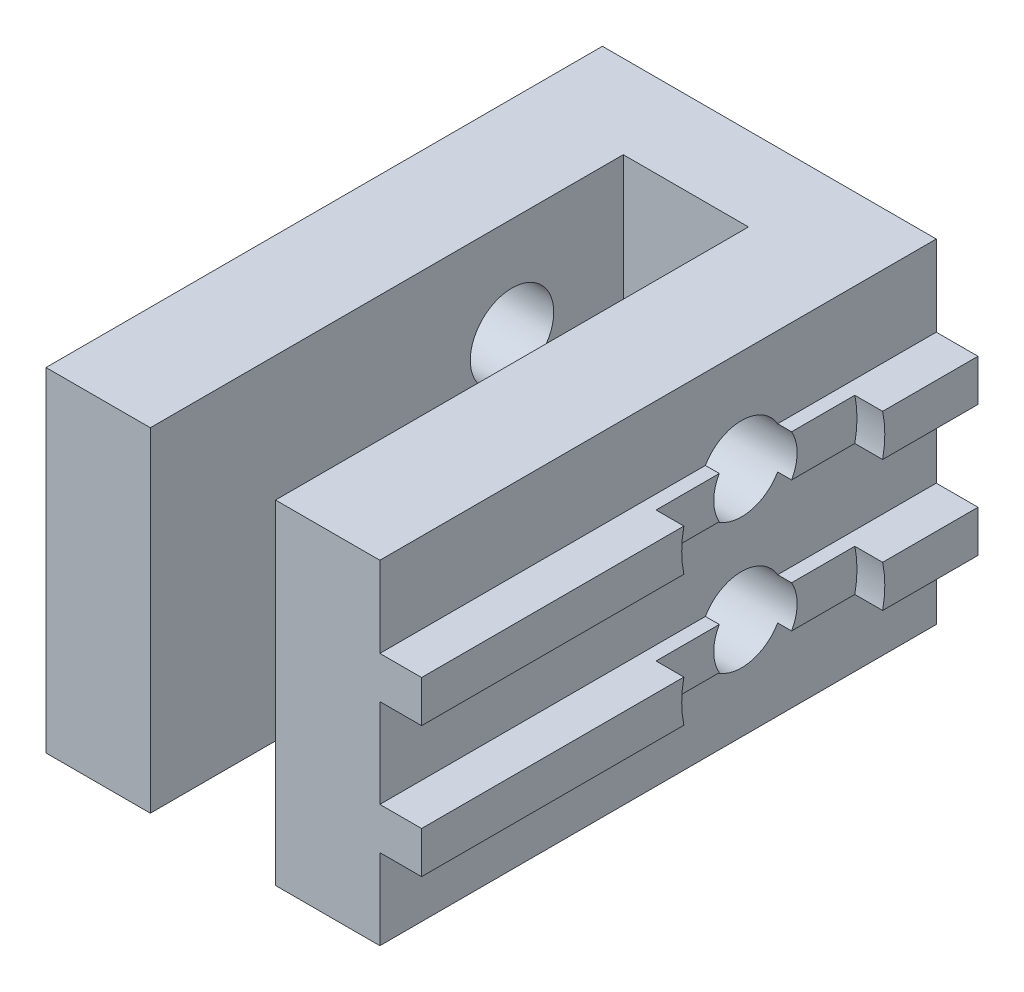
ISO-10303-21;
HEADER;
FILE_DESCRIPTION(('STEP AP214'),'2;1');
FILE_NAME('part.step','',(''),(''),'','','');
FILE_SCHEMA(('AUTOMOTIVE_DESIGN { 1 0 10303 214 1 1 1 1 }'));
ENDSEC;
DATA;
#1=APPLICATION_CONTEXT('core data for automotive mechanical design processes');
#2=APPLICATION_PROTOCOL_DEFINITION('international standard','automotive_design',2000,#1);
#3=PRODUCT_CONTEXT('',#1,'mechanical');
#4=PRODUCT('Part','Part','',(#3));
#5=PRODUCT_RELATED_PRODUCT_CATEGORY('part','',(#4));
#6=PRODUCT_DEFINITION_FORMATION('','',#4);
#7=PRODUCT_DEFINITION_CONTEXT('part definition',#1,'design');
#8=PRODUCT_DEFINITION('design','',#6,#7);
#9=PRODUCT_DEFINITION_SHAPE('','',#8);
#10=(LENGTH_UNIT() NAMED_UNIT(*) SI_UNIT(.MILLI.,.METRE.));
#11=(NAMED_UNIT(*) PLANE_ANGLE_UNIT() SI_UNIT($,.RADIAN.));
#12=(NAMED_UNIT(*) SI_UNIT($,.STERADIAN.) SOLID_ANGLE_UNIT());
#13=UNCERTAINTY_MEASURE_WITH_UNIT(LENGTH_MEASURE(1.E-05),#10,'distance_accuracy_value','');
#14=(GEOMETRIC_REPRESENTATION_CONTEXT(3) GLOBAL_UNCERTAINTY_ASSIGNED_CONTEXT((#13)) GLOBAL_UNIT_ASSIGNED_CONTEXT((#10,
#11,#12)) REPRESENTATION_CONTEXT('',''));
#15=CARTESIAN_POINT('',(0.,0.,0.));
#16=DIRECTION('',(0.,0.,1.));
#17=DIRECTION('',(1.,0.,0.));
#18=AXIS2_PLACEMENT_3D('',#15,#16,#17);
#19=CARTESIAN_POINT('',(13.5,2.9,20.));
#20=DIRECTION('',(0.,1.,0.));
#21=DIRECTION('',(-1.,0.,0.));
#22=AXIS2_PLACEMENT_3D('',#19,#20,#21);
#23=PLANE('',#22);
#24=DIRECTION('',(0.,0.,-1.));
#25=VECTOR('',#24,1.);
#26=CARTESIAN_POINT('',(12.,2.9,20.));
#27=LINE('',#26,#25);
#28=CARTESIAN_POINT('',(12.,2.9,20.));
#29=VERTEX_POINT('',#28);
#30=CARTESIAN_POINT('',(12.,2.9,8.29903810567666));
#31=VERTEX_POINT('',#30);
#32=EDGE_CURVE('E410',#29,#31,#27,.T.);
#33=ORIENTED_EDGE('',*,*,#32,.T.);
#34=DIRECTION('',(1.,0.,0.));
#35=VECTOR('',#34,1.);
#36=CARTESIAN_POINT('',(0.,2.89999999999999,8.29903810567665));
#37=LINE('',#36,#35);
#38=CARTESIAN_POINT('',(12.5,2.89999999999999,8.29903810567665));
#39=VERTEX_POINT('',#38);
#40=EDGE_CURVE('E492',#31,#39,#37,.T.);
#41=ORIENTED_EDGE('',*,*,#40,.T.);
#42=DIRECTION('',(0.,0.,-1.));
#43=VECTOR('',#42,1.);
#44=CARTESIAN_POINT('',(12.5,2.9,20.));
#45=LINE('',#44,#43);
#46=CARTESIAN_POINT('',(12.5,2.9,10.5721142198983));
#47=VERTEX_POINT('',#46);
#48=EDGE_CURVE('E270',#47,#39,#45,.T.);
#49=ORIENTED_EDGE('',*,*,#48,.F.);
#50=DIRECTION('',(1.,0.,0.));
#51=VECTOR('',#50,1.);
#52=CARTESIAN_POINT('',(12.5,2.9,10.5721142198983));
#53=LINE('',#52,#51);
#54=CARTESIAN_POINT('',(13.5,2.9,10.5721142198983));
#55=VERTEX_POINT('',#54);
#56=EDGE_CURVE('E286',#47,#55,#53,.T.);
#57=ORIENTED_EDGE('',*,*,#56,.T.);
#58=DIRECTION('',(0.,0.,-1.));
#59=VECTOR('',#58,1.);
#60=CARTESIAN_POINT('',(13.5,2.9,20.));
#61=LINE('',#60,#59);
#62=CARTESIAN_POINT('',(13.5,2.9,20.));
#63=VERTEX_POINT('',#62);
#64=EDGE_CURVE('E406',#63,#55,#61,.T.);
#65=ORIENTED_EDGE('',*,*,#64,.F.);
#66=DIRECTION('',(1.,0.,0.));
#67=VECTOR('',#66,1.);
#68=CARTESIAN_POINT('',(13.5,2.9,20.));
#69=LINE('',#68,#67);
#70=EDGE_CURVE('E326',#29,#63,#69,.T.);
#71=ORIENTED_EDGE('',*,*,#70,.F.);
#72=EDGE_LOOP('',(#33,#41,#49,#57,#65,#71));
#73=FACE_BOUND('',#72,.T.);
#74=ADVANCED_FACE('F35',(#73),#23,.F.);
#75=CARTESIAN_POINT('',(12.,4.4,20.));
#76=DIRECTION('',(0.,-1.,0.));
#77=DIRECTION('',(0.,0.,-1.));
#78=AXIS2_PLACEMENT_3D('',#75,#76,#77);
#79=PLANE('',#78);
#80=DIRECTION('',(0.,0.,-1.));
#81=VECTOR('',#80,1.);
#82=CARTESIAN_POINT('',(12.,4.4,20.));
#83=LINE('',#82,#81);
#84=CARTESIAN_POINT('',(12.,4.4,5.70096189432334));
#85=VERTEX_POINT('',#84);
#86=CARTESIAN_POINT('',(12.,4.4,0.));
#87=VERTEX_POINT('',#86);
#88=EDGE_CURVE('E262',#85,#87,#83,.T.);
#89=ORIENTED_EDGE('',*,*,#88,.F.);
#90=DIRECTION('',(1.,0.,0.));
#91=VECTOR('',#90,1.);
#92=CARTESIAN_POINT('',(0.,4.4,5.70096189432334));
#93=LINE('',#92,#91);
#94=CARTESIAN_POINT('',(12.5,4.4,5.70096189432334));
#95=VERTEX_POINT('',#94);
#96=EDGE_CURVE('E249',#85,#95,#93,.T.);
#97=ORIENTED_EDGE('',*,*,#96,.T.);
#98=DIRECTION('',(0.,0.,1.));
#99=VECTOR('',#98,1.);
#100=CARTESIAN_POINT('',(12.5,4.4,20.));
#101=LINE('',#100,#99);
#102=CARTESIAN_POINT('',(12.5,4.4,3.42788578010165));
#103=VERTEX_POINT('',#102);
#104=EDGE_CURVE('E260',#103,#95,#101,.T.);
#105=ORIENTED_EDGE('',*,*,#104,.F.);
#106=DIRECTION('',(1.,0.,0.));
#107=VECTOR('',#106,1.);
#108=CARTESIAN_POINT('',(12.5,4.4,3.42788578010165));
#109=LINE('',#108,#107);
#110=CARTESIAN_POINT('',(13.5,4.4,3.42788578010165));
#111=VERTEX_POINT('',#110);
#112=EDGE_CURVE('E11',#103,#111,#109,.T.);
#113=ORIENTED_EDGE('',*,*,#112,.T.);
#114=DIRECTION('',(0.,0.,-1.));
#115=VECTOR('',#114,1.);
#116=CARTESIAN_POINT('',(13.5,4.4,20.));
#117=LINE('',#116,#115);
#118=CARTESIAN_POINT('',(13.5,4.4,0.));
#119=VERTEX_POINT('',#118);
#120=EDGE_CURVE('E401',#111,#119,#117,.T.);
#121=ORIENTED_EDGE('',*,*,#120,.T.);
#122=DIRECTION('',(-1.,0.,0.));
#123=VECTOR('',#122,1.);
#124=CARTESIAN_POINT('',(12.,4.4,0.));
#125=LINE('',#124,#123);
#126=EDGE_CURVE('E360',#119,#87,#125,.T.);
#127=ORIENTED_EDGE('',*,*,#126,.T.);
#128=EDGE_LOOP('',(#89,#97,#105,#113,#121,#127));
#129=FACE_BOUND('',#128,.T.);
#130=ADVANCED_FACE('F259',(#129),#79,.F.);
#131=CARTESIAN_POINT('',(13.5,7.6,20.));
#132=DIRECTION('',(0.,1.,0.));
#133=DIRECTION('',(-1.,0.,0.));
#134=AXIS2_PLACEMENT_3D('',#131,#132,#133);
#135=PLANE('',#134);
#136=DIRECTION('',(0.,0.,-1.));
#137=VECTOR('',#136,1.);
#138=CARTESIAN_POINT('',(12.,7.6,20.));
#139=LINE('',#138,#137);
#140=CARTESIAN_POINT('',(12.,7.6,20.));
#141=VERTEX_POINT('',#140);
#142=CARTESIAN_POINT('',(12.,7.6,8.29903810567666));
#143=VERTEX_POINT('',#142);
#144=EDGE_CURVE('E395',#141,#143,#139,.T.);
#145=ORIENTED_EDGE('',*,*,#144,.T.);
#146=DIRECTION('',(1.,0.,0.));
#147=VECTOR('',#146,1.);
#148=CARTESIAN_POINT('',(0.,7.59999999999999,8.29903810567665));
#149=LINE('',#148,#147);
#150=CARTESIAN_POINT('',(12.5,7.59999999999999,8.29903810567665));
#151=VERTEX_POINT('',#150);
#152=EDGE_CURVE('E470',#143,#151,#149,.T.);
#153=ORIENTED_EDGE('',*,*,#152,.T.);
#154=DIRECTION('',(0.,0.,-1.));
#155=VECTOR('',#154,1.);
#156=CARTESIAN_POINT('',(12.5,7.6,20.));
#157=LINE('',#156,#155);
#158=CARTESIAN_POINT('',(12.5,7.6,10.5721142198983));
#159=VERTEX_POINT('',#158);
#160=EDGE_CURVE('E272',#159,#151,#157,.T.);
#161=ORIENTED_EDGE('',*,*,#160,.F.);
#162=DIRECTION('',(1.,0.,0.));
#163=VECTOR('',#162,1.);
#164=CARTESIAN_POINT('',(12.5,7.6,10.5721142198983));
#165=LINE('',#164,#163);
#166=CARTESIAN_POINT('',(13.5,7.6,10.5721142198983));
#167=VERTEX_POINT('',#166);
#168=EDGE_CURVE('E280',#159,#167,#165,.T.);
#169=ORIENTED_EDGE('',*,*,#168,.T.);
#170=DIRECTION('',(0.,0.,-1.));
#171=VECTOR('',#170,1.);
#172=CARTESIAN_POINT('',(13.5,7.6,20.));
#173=LINE('',#172,#171);
#174=CARTESIAN_POINT('',(13.5,7.6,20.));
#175=VERTEX_POINT('',#174);
#176=EDGE_CURVE('E391',#175,#167,#173,.T.);
#177=ORIENTED_EDGE('',*,*,#176,.F.);
#178=DIRECTION('',(1.,0.,0.));
#179=VECTOR('',#178,1.);
#180=CARTESIAN_POINT('',(13.5,7.6,20.));
#181=LINE('',#180,#179);
#182=EDGE_CURVE('E334',#141,#175,#181,.T.);
#183=ORIENTED_EDGE('',*,*,#182,.F.);
#184=EDGE_LOOP('',(#145,#153,#161,#169,#177,#183));
#185=FACE_BOUND('',#184,.T.);
#186=ADVANCED_FACE('F612',(#185),#135,.F.);
#187=CARTESIAN_POINT('',(12.,9.1,20.));
#188=DIRECTION('',(0.,-1.,0.));
#189=DIRECTION('',(0.,0.,-1.));
#190=AXIS2_PLACEMENT_3D('',#187,#188,#189);
#191=PLANE('',#190);
#192=DIRECTION('',(0.,0.,-1.));
#193=VECTOR('',#192,1.);
#194=CARTESIAN_POINT('',(12.,9.1,20.));
#195=LINE('',#194,#193);
#196=CARTESIAN_POINT('',(12.,9.1,5.70096189432334));
#197=VERTEX_POINT('',#196);
#198=CARTESIAN_POINT('',(12.,9.1,0.));
#199=VERTEX_POINT('',#198);
#200=EDGE_CURVE('E382',#197,#199,#195,.T.);
#201=ORIENTED_EDGE('',*,*,#200,.F.);
#202=DIRECTION('',(1.,0.,0.));
#203=VECTOR('',#202,1.);
#204=CARTESIAN_POINT('',(0.,9.1,5.70096189432334));
#205=LINE('',#204,#203);
#206=CARTESIAN_POINT('',(12.5,9.1,5.70096189432334));
#207=VERTEX_POINT('',#206);
#208=EDGE_CURVE('E463',#197,#207,#205,.T.);
#209=ORIENTED_EDGE('',*,*,#208,.T.);
#210=DIRECTION('',(0.,0.,1.));
#211=VECTOR('',#210,1.);
#212=CARTESIAN_POINT('',(12.5,9.1,20.));
#213=LINE('',#212,#211);
#214=CARTESIAN_POINT('',(12.5,9.1,3.42788578010165));
#215=VERTEX_POINT('',#214);
#216=EDGE_CURVE('E422',#215,#207,#213,.T.);
#217=ORIENTED_EDGE('',*,*,#216,.F.);
#218=DIRECTION('',(1.,0.,0.));
#219=VECTOR('',#218,1.);
#220=CARTESIAN_POINT('',(12.5,9.1,3.42788578010165));
#221=LINE('',#220,#219);
#222=CARTESIAN_POINT('',(13.5,9.1,3.42788578010165));
#223=VERTEX_POINT('',#222);
#224=EDGE_CURVE('E425',#215,#223,#221,.T.);
#225=ORIENTED_EDGE('',*,*,#224,.T.);
#226=DIRECTION('',(0.,0.,-1.));
#227=VECTOR('',#226,1.);
#228=CARTESIAN_POINT('',(13.5,9.1,20.));
#229=LINE('',#228,#227);
#230=CARTESIAN_POINT('',(13.5,9.1,0.));
#231=VERTEX_POINT('',#230);
#232=EDGE_CURVE('E386',#223,#231,#229,.T.);
#233=ORIENTED_EDGE('',*,*,#232,.T.);
#234=DIRECTION('',(-1.,0.,0.));
#235=VECTOR('',#234,1.);
#236=CARTESIAN_POINT('',(12.,9.1,0.));
#237=LINE('',#236,#235);
#238=EDGE_CURVE('E371',#231,#199,#237,.T.);
#239=ORIENTED_EDGE('',*,*,#238,.T.);
#240=EDGE_LOOP('',(#201,#209,#217,#225,#233,#239));
#241=FACE_BOUND('',#240,.T.);
#242=ADVANCED_FACE('F652',(#241),#191,.F.);
#243=CARTESIAN_POINT('',(13.5,4.4,20.));
#244=DIRECTION('',(-1.,0.,0.));
#245=DIRECTION('',(0.,0.,1.));
#246=AXIS2_PLACEMENT_3D('',#243,#244,#245);
#247=PLANE('',#246);
#248=ORIENTED_EDGE('',*,*,#120,.F.);
#249=CARTESIAN_POINT('',(13.5,3.65,7.));
#250=DIRECTION('',(1.,0.,0.));
#251=DIRECTION('',(0.,0.,-1.));
#252=AXIS2_PLACEMENT_3D('',#249,#250,#251);
#253=CIRCLE('',#252,3.65);
#254=CARTESIAN_POINT('',(13.5,2.9,3.42788578010165));
#255=VERTEX_POINT('',#254);
#256=EDGE_CURVE('E446',#255,#111,#253,.T.);
#257=ORIENTED_EDGE('',*,*,#256,.F.);
#258=CARTESIAN_POINT('',(13.5,2.9,0.));
#259=VERTEX_POINT('',#258);
#260=EDGE_CURVE('E405',#255,#259,#61,.T.);
#261=ORIENTED_EDGE('',*,*,#260,.T.);
#262=DIRECTION('',(0.,1.,0.));
#263=VECTOR('',#262,1.);
#264=CARTESIAN_POINT('',(13.5,4.4,0.));
#265=LINE('',#264,#263);
#266=EDGE_CURVE('E357',#259,#119,#265,.T.);
#267=ORIENTED_EDGE('',*,*,#266,.T.);
#268=EDGE_LOOP('',(#248,#257,#261,#267));
#269=FACE_BOUND('',#268,.T.);
#270=ADVANCED_FACE('F621',(#269),#247,.F.);
#271=CARTESIAN_POINT('',(13.5,9.1,20.));
#272=DIRECTION('',(-1.,0.,0.));
#273=DIRECTION('',(0.,0.,1.));
#274=AXIS2_PLACEMENT_3D('',#271,#272,#273);
#275=PLANE('',#274);
#276=ORIENTED_EDGE('',*,*,#232,.F.);
#277=CARTESIAN_POINT('',(13.5,8.35,7.));
#278=DIRECTION('',(1.,0.,0.));
#279=DIRECTION('',(0.,0.,-1.));
#280=AXIS2_PLACEMENT_3D('',#277,#278,#279);
#281=CIRCLE('',#280,3.65);
#282=CARTESIAN_POINT('',(13.5,7.6,3.42788578010165));
#283=VERTEX_POINT('',#282);
#284=EDGE_CURVE('E448',#283,#223,#281,.T.);
#285=ORIENTED_EDGE('',*,*,#284,.F.);
#286=CARTESIAN_POINT('',(13.5,7.6,0.));
#287=VERTEX_POINT('',#286);
#288=EDGE_CURVE('E390',#283,#287,#173,.T.);
#289=ORIENTED_EDGE('',*,*,#288,.T.);
#290=DIRECTION('',(0.,1.,0.));
#291=VECTOR('',#290,1.);
#292=CARTESIAN_POINT('',(13.5,9.1,0.));
#293=LINE('',#292,#291);
#294=EDGE_CURVE('E368',#287,#231,#293,.T.);
#295=ORIENTED_EDGE('',*,*,#294,.T.);
#296=EDGE_LOOP('',(#276,#285,#289,#295));
#297=FACE_BOUND('',#296,.T.);
#298=ADVANCED_FACE('F631',(#297),#275,.F.);
#299=CARTESIAN_POINT('',(0.,12.,20.));
#300=DIRECTION('',(0.,0.,-1.));
#301=DIRECTION('',(-1.,0.,0.));
#302=AXIS2_PLACEMENT_3D('',#299,#300,#301);
#303=PLANE('',#302);
#304=DIRECTION('',(1.,0.,0.));
#305=VECTOR('',#304,1.);
#306=CARTESIAN_POINT('',(0.,0.,20.));
#307=LINE('',#306,#305);
#308=CARTESIAN_POINT('',(0.,0.,20.));
#309=VERTEX_POINT('',#308);
#310=CARTESIAN_POINT('',(3.75,0.,20.));
#311=VERTEX_POINT('',#310);
#312=EDGE_CURVE('E321',#309,#311,#307,.T.);
#313=ORIENTED_EDGE('',*,*,#312,.T.);
#314=DIRECTION('',(0.,-1.,0.));
#315=VECTOR('',#314,1.);
#316=CARTESIAN_POINT('',(3.75,12.,20.));
#317=LINE('',#316,#315);
#318=CARTESIAN_POINT('',(3.75,12.,20.));
#319=VERTEX_POINT('',#318);
#320=EDGE_CURVE('E289',#319,#311,#317,.T.);
#321=ORIENTED_EDGE('',*,*,#320,.F.);
#322=DIRECTION('',(-1.,0.,0.));
#323=VECTOR('',#322,1.);
#324=CARTESIAN_POINT('',(0.,12.,20.));
#325=LINE('',#324,#323);
#326=CARTESIAN_POINT('',(0.,12.,20.));
#327=VERTEX_POINT('',#326);
#328=EDGE_CURVE('E342',#319,#327,#325,.T.);
#329=ORIENTED_EDGE('',*,*,#328,.T.);
#330=DIRECTION('',(0.,-1.,0.));
#331=VECTOR('',#330,1.);
#332=CARTESIAN_POINT('',(0.,0.,20.));
#333=LINE('',#332,#331);
#334=EDGE_CURVE('E316',#327,#309,#333,.T.);
#335=ORIENTED_EDGE('',*,*,#334,.T.);
#336=EDGE_LOOP('',(#313,#321,#329,#335));
#337=FACE_BOUND('',#336,.T.);
#338=ADVANCED_FACE('F527',(#337),#303,.F.);
#339=CARTESIAN_POINT('',(0.,0.,20.));
#340=DIRECTION('',(1.,0.,0.));
#341=DIRECTION('',(0.,0.,-1.));
#342=AXIS2_PLACEMENT_3D('',#339,#340,#341);
#343=PLANE('',#342);
#344=CARTESIAN_POINT('',(0.,3.65,7.));
#345=DIRECTION('',(1.,0.,0.));
#346=DIRECTION('',(0.,0.,-1.));
#347=AXIS2_PLACEMENT_3D('',#344,#345,#346);
#348=CIRCLE('',#347,1.5);
#349=CARTESIAN_POINT('',(0.,3.65,5.5));
#350=VERTEX_POINT('',#349);
#351=EDGE_CURVE('E498',#350,#350,#348,.T.);
#352=ORIENTED_EDGE('',*,*,#351,.T.);
#353=EDGE_LOOP('',(#352));
#354=FACE_BOUND('',#353,.T.);
#355=CARTESIAN_POINT('',(0.,8.35,7.));
#356=DIRECTION('',(1.,0.,0.));
#357=DIRECTION('',(0.,0.,-1.));
#358=AXIS2_PLACEMENT_3D('',#355,#356,#357);
#359=CIRCLE('',#358,1.5);
#360=CARTESIAN_POINT('',(0.,8.35,5.5));
#361=VERTEX_POINT('',#360);
#362=EDGE_CURVE('E479',#361,#361,#359,.T.);
#363=ORIENTED_EDGE('',*,*,#362,.T.);
#364=EDGE_LOOP('',(#363));
#365=FACE_BOUND('',#364,.T.);
#366=DIRECTION('',(0.,-1.,0.));
#367=VECTOR('',#366,1.);
#368=CARTESIAN_POINT('',(0.,0.,0.));
#369=LINE('',#368,#367);
#370=CARTESIAN_POINT('',(0.,12.,0.));
#371=VERTEX_POINT('',#370);
#372=CARTESIAN_POINT('',(0.,0.,0.));
#373=VERTEX_POINT('',#372);
#374=EDGE_CURVE('E308',#371,#373,#369,.T.);
#375=ORIENTED_EDGE('',*,*,#374,.T.);
#376=DIRECTION('',(0.,0.,-1.));
#377=VECTOR('',#376,1.);
#378=CARTESIAN_POINT('',(0.,0.,20.));
#379=LINE('',#378,#377);
#380=EDGE_CURVE('E416',#309,#373,#379,.T.);
#381=ORIENTED_EDGE('',*,*,#380,.F.);
#382=ORIENTED_EDGE('',*,*,#334,.F.);
#383=DIRECTION('',(0.,0.,-1.));
#384=VECTOR('',#383,1.);
#385=CARTESIAN_POINT('',(0.,12.,20.));
#386=LINE('',#385,#384);
#387=EDGE_CURVE('E346',#327,#371,#386,.T.);
#388=ORIENTED_EDGE('',*,*,#387,.T.);
#389=EDGE_LOOP('',(#375,#381,#382,#388));
#390=FACE_BOUND('',#389,.T.);
#391=ADVANCED_FACE('F37',(#354,#365,#390),#343,.F.);
#392=CARTESIAN_POINT('',(0.,0.,20.));
#393=DIRECTION('',(0.,1.,0.));
#394=DIRECTION('',(0.,0.,1.));
#395=AXIS2_PLACEMENT_3D('',#392,#393,#394);
#396=PLANE('',#395);
#397=DIRECTION('',(1.,0.,0.));
#398=VECTOR('',#397,1.);
#399=CARTESIAN_POINT('',(3.75,0.,3.));
#400=LINE('',#399,#398);
#401=CARTESIAN_POINT('',(3.75,0.,3.));
#402=VERTEX_POINT('',#401);
#403=CARTESIAN_POINT('',(8.25,0.,3.));
#404=VERTEX_POINT('',#403);
#405=EDGE_CURVE('E293',#402,#404,#400,.T.);
#406=ORIENTED_EDGE('',*,*,#405,.F.);
#407=DIRECTION('',(0.,0.,1.));
#408=VECTOR('',#407,1.);
#409=CARTESIAN_POINT('',(3.75,0.,3.));
#410=LINE('',#409,#408);
#411=EDGE_CURVE('E303',#402,#311,#410,.T.);
#412=ORIENTED_EDGE('',*,*,#411,.T.);
#413=ORIENTED_EDGE('',*,*,#312,.F.);
#414=ORIENTED_EDGE('',*,*,#380,.T.);
#415=DIRECTION('',(1.,0.,0.));
#416=VECTOR('',#415,1.);
#417=CARTESIAN_POINT('',(0.,0.,0.));
#418=LINE('',#417,#416);
#419=CARTESIAN_POINT('',(12.,0.,0.));
#420=VERTEX_POINT('',#419);
#421=EDGE_CURVE('E349',#373,#420,#418,.T.);
#422=ORIENTED_EDGE('',*,*,#421,.T.);
#423=DIRECTION('',(0.,0.,-1.));
#424=VECTOR('',#423,1.);
#425=CARTESIAN_POINT('',(12.,0.,20.));
#426=LINE('',#425,#424);
#427=CARTESIAN_POINT('',(12.,0.,20.));
#428=VERTEX_POINT('',#427);
#429=EDGE_CURVE('E413',#428,#420,#426,.T.);
#430=ORIENTED_EDGE('',*,*,#429,.F.);
#431=CARTESIAN_POINT('',(8.25,0.,20.));
#432=VERTEX_POINT('',#431);
#433=EDGE_CURVE('E319',#432,#428,#307,.T.);
#434=ORIENTED_EDGE('',*,*,#433,.F.);
#435=DIRECTION('',(0.,0.,1.));
#436=VECTOR('',#435,1.);
#437=CARTESIAN_POINT('',(8.25,0.,3.));
#438=LINE('',#437,#436);
#439=EDGE_CURVE('E312',#404,#432,#438,.T.);
#440=ORIENTED_EDGE('',*,*,#439,.F.);
#441=EDGE_LOOP('',(#406,#412,#413,#414,#422,#430,#434,#440));
#442=FACE_BOUND('',#441,.T.);
#443=ADVANCED_FACE('F525',(#442),#396,.F.);
#444=CARTESIAN_POINT('',(12.,0.,20.));
#445=DIRECTION('',(-1.,0.,0.));
#446=DIRECTION('',(0.,0.,1.));
#447=AXIS2_PLACEMENT_3D('',#444,#445,#446);
#448=PLANE('',#447);
#449=CARTESIAN_POINT('',(12.,2.89999999999999,5.70096189432335));
#450=VERTEX_POINT('',#449);
#451=CARTESIAN_POINT('',(12.,2.9,0.));
#452=VERTEX_POINT('',#451);
#453=EDGE_CURVE('E409',#450,#452,#27,.T.);
#454=ORIENTED_EDGE('',*,*,#453,.F.);
#455=CARTESIAN_POINT('',(12.,3.65,7.));
#456=DIRECTION('',(-1.,0.,0.));
#457=DIRECTION('',(0.,0.,1.));
#458=AXIS2_PLACEMENT_3D('',#455,#456,#457);
#459=CIRCLE('',#458,1.5);
#460=EDGE_CURVE('E495',#450,#31,#459,.T.);
#461=ORIENTED_EDGE('',*,*,#460,.T.);
#462=ORIENTED_EDGE('',*,*,#32,.F.);
#463=DIRECTION('',(0.,1.,0.));
#464=VECTOR('',#463,1.);
#465=CARTESIAN_POINT('',(12.,0.,20.));
#466=LINE('',#465,#464);
#467=EDGE_CURVE('E324',#428,#29,#466,.T.);
#468=ORIENTED_EDGE('',*,*,#467,.F.);
#469=ORIENTED_EDGE('',*,*,#429,.T.);
#470=DIRECTION('',(0.,1.,0.));
#471=VECTOR('',#470,1.);
#472=CARTESIAN_POINT('',(12.,0.,0.));
#473=LINE('',#472,#471);
#474=EDGE_CURVE('E351',#420,#452,#473,.T.);
#475=ORIENTED_EDGE('',*,*,#474,.T.);
#476=EDGE_LOOP('',(#454,#461,#462,#468,#469,#475));
#477=FACE_BOUND('',#476,.T.);
#478=ADVANCED_FACE('F540',(#477),#448,.F.);
#479=CARTESIAN_POINT('',(12.5,2.9,5.70096189432334));
#480=VERTEX_POINT('',#479);
#481=CARTESIAN_POINT('',(12.5,2.9,3.42788578010165));
#482=VERTEX_POINT('',#481);
#483=EDGE_CURVE('E267',#480,#482,#45,.T.);
#484=ORIENTED_EDGE('',*,*,#483,.F.);
#485=DIRECTION('',(1.,0.,0.));
#486=VECTOR('',#485,1.);
#487=CARTESIAN_POINT('',(0.,2.89999999999999,5.70096189432335));
#488=LINE('',#487,#486);
#489=EDGE_CURVE('E252',#480,#450,#488,.F.);
#490=ORIENTED_EDGE('',*,*,#489,.T.);
#491=ORIENTED_EDGE('',*,*,#453,.T.);
#492=DIRECTION('',(1.,0.,0.));
#493=VECTOR('',#492,1.);
#494=CARTESIAN_POINT('',(13.5,2.9,0.));
#495=LINE('',#494,#493);
#496=EDGE_CURVE('E354',#452,#259,#495,.T.);
#497=ORIENTED_EDGE('',*,*,#496,.T.);
#498=ORIENTED_EDGE('',*,*,#260,.F.);
#499=DIRECTION('',(1.,0.,0.));
#500=VECTOR('',#499,1.);
#501=CARTESIAN_POINT('',(12.5,2.9,3.42788578010165));
#502=LINE('',#501,#500);
#503=EDGE_CURVE('E283',#255,#482,#502,.F.);
#504=ORIENTED_EDGE('',*,*,#503,.T.);
#505=EDGE_LOOP('',(#484,#490,#491,#497,#498,#504));
#506=FACE_BOUND('',#505,.T.);
#507=ADVANCED_FACE('F547',(#506),#23,.F.);
#508=ORIENTED_EDGE('',*,*,#64,.T.);
#509=CARTESIAN_POINT('',(13.5,4.4,10.5721142198983));
#510=VERTEX_POINT('',#509);
#511=EDGE_CURVE('E438',#510,#55,#253,.T.);
#512=ORIENTED_EDGE('',*,*,#511,.F.);
#513=CARTESIAN_POINT('',(13.5,4.4,20.));
#514=VERTEX_POINT('',#513);
#515=EDGE_CURVE('E402',#514,#510,#117,.T.);
#516=ORIENTED_EDGE('',*,*,#515,.F.);
#517=DIRECTION('',(0.,1.,0.));
#518=VECTOR('',#517,1.);
#519=CARTESIAN_POINT('',(13.5,4.4,20.));
#520=LINE('',#519,#518);
#521=EDGE_CURVE('E328',#63,#514,#520,.T.);
#522=ORIENTED_EDGE('',*,*,#521,.F.);
#523=EDGE_LOOP('',(#508,#512,#516,#522));
#524=FACE_BOUND('',#523,.T.);
#525=ADVANCED_FACE('F442',(#524),#247,.F.);
#526=CARTESIAN_POINT('',(12.5,4.4,8.29903810567666));
#527=VERTEX_POINT('',#526);
#528=CARTESIAN_POINT('',(12.5,4.4,10.5721142198983));
#529=VERTEX_POINT('',#528);
#530=EDGE_CURVE('E268',#527,#529,#101,.T.);
#531=ORIENTED_EDGE('',*,*,#530,.F.);
#532=DIRECTION('',(1.,0.,0.));
#533=VECTOR('',#532,1.);
#534=CARTESIAN_POINT('',(0.,4.4,8.29903810567666));
#535=LINE('',#534,#533);
#536=CARTESIAN_POINT('',(12.,4.4,8.29903810567666));
#537=VERTEX_POINT('',#536);
#538=EDGE_CURVE('E490',#527,#537,#535,.F.);
#539=ORIENTED_EDGE('',*,*,#538,.T.);
#540=CARTESIAN_POINT('',(12.,4.4,20.));
#541=VERTEX_POINT('',#540);
#542=EDGE_CURVE('E398',#541,#537,#83,.T.);
#543=ORIENTED_EDGE('',*,*,#542,.F.);
#544=DIRECTION('',(-1.,0.,0.));
#545=VECTOR('',#544,1.);
#546=CARTESIAN_POINT('',(12.,4.4,20.));
#547=LINE('',#546,#545);
#548=EDGE_CURVE('E330',#514,#541,#547,.T.);
#549=ORIENTED_EDGE('',*,*,#548,.F.);
#550=ORIENTED_EDGE('',*,*,#515,.T.);
#551=DIRECTION('',(1.,0.,0.));
#552=VECTOR('',#551,1.);
#553=CARTESIAN_POINT('',(12.5,4.4,10.5721142198983));
#554=LINE('',#553,#552);
#555=EDGE_CURVE('E43',#510,#529,#554,.F.);
#556=ORIENTED_EDGE('',*,*,#555,.T.);
#557=EDGE_LOOP('',(#531,#539,#543,#549,#550,#556));
#558=FACE_BOUND('',#557,.T.);
#559=ADVANCED_FACE('F430',(#558),#79,.F.);
#560=CARTESIAN_POINT('',(12.,7.6,20.));
#561=DIRECTION('',(-1.,0.,0.));
#562=DIRECTION('',(0.,0.,1.));
#563=AXIS2_PLACEMENT_3D('',#560,#561,#562);
#564=PLANE('',#563);
#565=ORIENTED_EDGE('',*,*,#542,.T.);
#566=CARTESIAN_POINT('',(12.,3.65,7.));
#567=DIRECTION('',(-1.,0.,0.));
#568=DIRECTION('',(0.,0.,1.));
#569=AXIS2_PLACEMENT_3D('',#566,#567,#568);
#570=CIRCLE('',#569,1.5);
#571=EDGE_CURVE('E264',#537,#85,#570,.T.);
#572=ORIENTED_EDGE('',*,*,#571,.T.);
#573=ORIENTED_EDGE('',*,*,#88,.T.);
#574=DIRECTION('',(0.,1.,0.));
#575=VECTOR('',#574,1.);
#576=CARTESIAN_POINT('',(12.,7.6,0.));
#577=LINE('',#576,#575);
#578=CARTESIAN_POINT('',(12.,7.6,0.));
#579=VERTEX_POINT('',#578);
#580=EDGE_CURVE('E362',#87,#579,#577,.T.);
#581=ORIENTED_EDGE('',*,*,#580,.T.);
#582=CARTESIAN_POINT('',(12.,7.59999999999999,5.70096189432335));
#583=VERTEX_POINT('',#582);
#584=EDGE_CURVE('E394',#583,#579,#139,.T.);
#585=ORIENTED_EDGE('',*,*,#584,.F.);
#586=CARTESIAN_POINT('',(12.,8.35,7.));
#587=DIRECTION('',(-1.,0.,0.));
#588=DIRECTION('',(0.,0.,1.));
#589=AXIS2_PLACEMENT_3D('',#586,#587,#588);
#590=CIRCLE('',#589,1.5);
#591=EDGE_CURVE('E473',#583,#143,#590,.T.);
#592=ORIENTED_EDGE('',*,*,#591,.T.);
#593=ORIENTED_EDGE('',*,*,#144,.F.);
#594=DIRECTION('',(0.,1.,0.));
#595=VECTOR('',#594,1.);
#596=CARTESIAN_POINT('',(12.,7.6,20.));
#597=LINE('',#596,#595);
#598=EDGE_CURVE('E332',#541,#141,#597,.T.);
#599=ORIENTED_EDGE('',*,*,#598,.F.);
#600=EDGE_LOOP('',(#565,#572,#573,#581,#585,#592,#593,#599));
#601=FACE_BOUND('',#600,.T.);
#602=ADVANCED_FACE('F659',(#601),#564,.F.);
#603=CARTESIAN_POINT('',(12.5,7.6,5.70096189432334));
#604=VERTEX_POINT('',#603);
#605=CARTESIAN_POINT('',(12.5,7.6,3.42788578010165));
#606=VERTEX_POINT('',#605);
#607=EDGE_CURVE('E274',#604,#606,#157,.T.);
#608=ORIENTED_EDGE('',*,*,#607,.F.);
#609=DIRECTION('',(1.,0.,0.));
#610=VECTOR('',#609,1.);
#611=CARTESIAN_POINT('',(0.,7.59999999999999,5.70096189432335));
#612=LINE('',#611,#610);
#613=EDGE_CURVE('E476',#604,#583,#612,.F.);
#614=ORIENTED_EDGE('',*,*,#613,.T.);
#615=ORIENTED_EDGE('',*,*,#584,.T.);
#616=DIRECTION('',(1.,0.,0.));
#617=VECTOR('',#616,1.);
#618=CARTESIAN_POINT('',(13.5,7.6,0.));
#619=LINE('',#618,#617);
#620=EDGE_CURVE('E365',#579,#287,#619,.T.);
#621=ORIENTED_EDGE('',*,*,#620,.T.);
#622=ORIENTED_EDGE('',*,*,#288,.F.);
#623=DIRECTION('',(1.,0.,0.));
#624=VECTOR('',#623,1.);
#625=CARTESIAN_POINT('',(12.5,7.6,3.42788578010165));
#626=LINE('',#625,#624);
#627=EDGE_CURVE('E277',#283,#606,#626,.F.);
#628=ORIENTED_EDGE('',*,*,#627,.T.);
#629=EDGE_LOOP('',(#608,#614,#615,#621,#622,#628));
#630=FACE_BOUND('',#629,.T.);
#631=ADVANCED_FACE('F655',(#630),#135,.F.);
#632=ORIENTED_EDGE('',*,*,#176,.T.);
#633=CARTESIAN_POINT('',(13.5,9.1,10.5721142198983));
#634=VERTEX_POINT('',#633);
#635=EDGE_CURVE('E445',#634,#167,#281,.T.);
#636=ORIENTED_EDGE('',*,*,#635,.F.);
#637=CARTESIAN_POINT('',(13.5,9.1,20.));
#638=VERTEX_POINT('',#637);
#639=EDGE_CURVE('E387',#638,#634,#229,.T.);
#640=ORIENTED_EDGE('',*,*,#639,.F.);
#641=DIRECTION('',(0.,1.,0.));
#642=VECTOR('',#641,1.);
#643=CARTESIAN_POINT('',(13.5,9.1,20.));
#644=LINE('',#643,#642);
#645=EDGE_CURVE('E336',#175,#638,#644,.T.);
#646=ORIENTED_EDGE('',*,*,#645,.F.);
#647=EDGE_LOOP('',(#632,#636,#640,#646));
#648=FACE_BOUND('',#647,.T.);
#649=ADVANCED_FACE('F638',(#648),#275,.F.);
#650=CARTESIAN_POINT('',(12.5,9.1,8.29903810567666));
#651=VERTEX_POINT('',#650);
#652=CARTESIAN_POINT('',(12.5,9.1,10.5721142198983));
#653=VERTEX_POINT('',#652);
#654=EDGE_CURVE('E419',#651,#653,#213,.T.);
#655=ORIENTED_EDGE('',*,*,#654,.F.);
#656=DIRECTION('',(1.,0.,0.));
#657=VECTOR('',#656,1.);
#658=CARTESIAN_POINT('',(0.,9.1,8.29903810567666));
#659=LINE('',#658,#657);
#660=CARTESIAN_POINT('',(12.,9.1,8.29903810567666));
#661=VERTEX_POINT('',#660);
#662=EDGE_CURVE('E467',#651,#661,#659,.F.);
#663=ORIENTED_EDGE('',*,*,#662,.T.);
#664=CARTESIAN_POINT('',(12.,9.1,20.));
#665=VERTEX_POINT('',#664);
#666=EDGE_CURVE('E383',#665,#661,#195,.T.);
#667=ORIENTED_EDGE('',*,*,#666,.F.);
#668=DIRECTION('',(-1.,0.,0.));
#669=VECTOR('',#668,1.);
#670=CARTESIAN_POINT('',(12.,9.1,20.));
#671=LINE('',#670,#669);
#672=EDGE_CURVE('E338',#638,#665,#671,.T.);
#673=ORIENTED_EDGE('',*,*,#672,.F.);
#674=ORIENTED_EDGE('',*,*,#639,.T.);
#675=DIRECTION('',(1.,0.,0.));
#676=VECTOR('',#675,1.);
#677=CARTESIAN_POINT('',(12.5,9.1,10.5721142198983));
#678=LINE('',#677,#676);
#679=EDGE_CURVE('E421',#634,#653,#678,.F.);
#680=ORIENTED_EDGE('',*,*,#679,.T.);
#681=EDGE_LOOP('',(#655,#663,#667,#673,#674,#680));
#682=FACE_BOUND('',#681,.T.);
#683=ADVANCED_FACE('F575',(#682),#191,.F.);
#684=CARTESIAN_POINT('',(12.,9.1,20.));
#685=DIRECTION('',(-1.,0.,0.));
#686=DIRECTION('',(0.,0.,1.));
#687=AXIS2_PLACEMENT_3D('',#684,#685,#686);
#688=PLANE('',#687);
#689=ORIENTED_EDGE('',*,*,#666,.T.);
#690=CARTESIAN_POINT('',(12.,8.35,7.));
#691=DIRECTION('',(-1.,0.,0.));
#692=DIRECTION('',(0.,0.,1.));
#693=AXIS2_PLACEMENT_3D('',#690,#691,#692);
#694=CIRCLE('',#693,1.5);
#695=EDGE_CURVE('E464',#661,#197,#694,.T.);
#696=ORIENTED_EDGE('',*,*,#695,.T.);
#697=ORIENTED_EDGE('',*,*,#200,.T.);
#698=DIRECTION('',(0.,1.,0.));
#699=VECTOR('',#698,1.);
#700=CARTESIAN_POINT('',(12.,9.1,0.));
#701=LINE('',#700,#699);
#702=CARTESIAN_POINT('',(12.,12.,0.));
#703=VERTEX_POINT('',#702);
#704=EDGE_CURVE('E374',#199,#703,#701,.T.);
#705=ORIENTED_EDGE('',*,*,#704,.T.);
#706=DIRECTION('',(0.,0.,-1.));
#707=VECTOR('',#706,1.);
#708=CARTESIAN_POINT('',(12.,12.,20.));
#709=LINE('',#708,#707);
#710=CARTESIAN_POINT('',(12.,12.,20.));
#711=VERTEX_POINT('',#710);
#712=EDGE_CURVE('E379',#711,#703,#709,.T.);
#713=ORIENTED_EDGE('',*,*,#712,.F.);
#714=DIRECTION('',(0.,1.,0.));
#715=VECTOR('',#714,1.);
#716=CARTESIAN_POINT('',(12.,9.1,20.));
#717=LINE('',#716,#715);
#718=EDGE_CURVE('E340',#665,#711,#717,.T.);
#719=ORIENTED_EDGE('',*,*,#718,.F.);
#720=EDGE_LOOP('',(#689,#696,#697,#705,#713,#719));
#721=FACE_BOUND('',#720,.T.);
#722=ADVANCED_FACE('F567',(#721),#688,.F.);
#723=CARTESIAN_POINT('',(0.,12.,20.));
#724=DIRECTION('',(0.,-1.,0.));
#725=DIRECTION('',(0.,0.,-1.));
#726=AXIS2_PLACEMENT_3D('',#723,#724,#725);
#727=PLANE('',#726);
#728=ORIENTED_EDGE('',*,*,#328,.F.);
#729=DIRECTION('',(0.,0.,1.));
#730=VECTOR('',#729,1.);
#731=CARTESIAN_POINT('',(3.75,12.,3.));
#732=LINE('',#731,#730);
#733=CARTESIAN_POINT('',(3.75,12.,3.));
#734=VERTEX_POINT('',#733);
#735=EDGE_CURVE('E306',#734,#319,#732,.T.);
#736=ORIENTED_EDGE('',*,*,#735,.F.);
#737=DIRECTION('',(-1.,0.,0.));
#738=VECTOR('',#737,1.);
#739=CARTESIAN_POINT('',(3.75,12.,3.));
#740=LINE('',#739,#738);
#741=CARTESIAN_POINT('',(8.25,12.,3.));
#742=VERTEX_POINT('',#741);
#743=EDGE_CURVE('E300',#742,#734,#740,.T.);
#744=ORIENTED_EDGE('',*,*,#743,.F.);
#745=DIRECTION('',(0.,0.,1.));
#746=VECTOR('',#745,1.);
#747=CARTESIAN_POINT('',(8.25,12.,3.));
#748=LINE('',#747,#746);
#749=CARTESIAN_POINT('',(8.25,12.,20.));
#750=VERTEX_POINT('',#749);
#751=EDGE_CURVE('E309',#742,#750,#748,.T.);
#752=ORIENTED_EDGE('',*,*,#751,.T.);
#753=EDGE_CURVE('E343',#711,#750,#325,.T.);
#754=ORIENTED_EDGE('',*,*,#753,.F.);
#755=ORIENTED_EDGE('',*,*,#712,.T.);
#756=DIRECTION('',(-1.,0.,0.));
#757=VECTOR('',#756,1.);
#758=CARTESIAN_POINT('',(0.,12.,0.));
#759=LINE('',#758,#757);
#760=EDGE_CURVE('E320',#703,#371,#759,.T.);
#761=ORIENTED_EDGE('',*,*,#760,.T.);
#762=ORIENTED_EDGE('',*,*,#387,.F.);
#763=EDGE_LOOP('',(#728,#736,#744,#752,#754,#755,#761,#762));
#764=FACE_BOUND('',#763,.T.);
#765=ADVANCED_FACE('F560',(#764),#727,.F.);
#766=ORIENTED_EDGE('',*,*,#753,.T.);
#767=DIRECTION('',(0.,1.,0.));
#768=VECTOR('',#767,1.);
#769=CARTESIAN_POINT('',(8.25,12.,20.));
#770=LINE('',#769,#768);
#771=EDGE_CURVE('E294',#432,#750,#770,.T.);
#772=ORIENTED_EDGE('',*,*,#771,.F.);
#773=ORIENTED_EDGE('',*,*,#433,.T.);
#774=ORIENTED_EDGE('',*,*,#467,.T.);
#775=ORIENTED_EDGE('',*,*,#70,.T.);
#776=ORIENTED_EDGE('',*,*,#521,.T.);
#777=ORIENTED_EDGE('',*,*,#548,.T.);
#778=ORIENTED_EDGE('',*,*,#598,.T.);
#779=ORIENTED_EDGE('',*,*,#182,.T.);
#780=ORIENTED_EDGE('',*,*,#645,.T.);
#781=ORIENTED_EDGE('',*,*,#672,.T.);
#782=ORIENTED_EDGE('',*,*,#718,.T.);
#783=EDGE_LOOP('',(#766,#772,#773,#774,#775,#776,#777,#778,#779,#780,#781,#782));
#784=FACE_BOUND('',#783,.T.);
#785=ADVANCED_FACE('F553',(#784),#303,.F.);
#786=CARTESIAN_POINT('',(0.,12.,0.));
#787=DIRECTION('',(0.,0.,-1.));
#788=DIRECTION('',(-1.,0.,0.));
#789=AXIS2_PLACEMENT_3D('',#786,#787,#788);
#790=PLANE('',#789);
#791=ORIENTED_EDGE('',*,*,#374,.F.);
#792=ORIENTED_EDGE('',*,*,#760,.F.);
#793=ORIENTED_EDGE('',*,*,#704,.F.);
#794=ORIENTED_EDGE('',*,*,#238,.F.);
#795=ORIENTED_EDGE('',*,*,#294,.F.);
#796=ORIENTED_EDGE('',*,*,#620,.F.);
#797=ORIENTED_EDGE('',*,*,#580,.F.);
#798=ORIENTED_EDGE('',*,*,#126,.F.);
#799=ORIENTED_EDGE('',*,*,#266,.F.);
#800=ORIENTED_EDGE('',*,*,#496,.F.);
#801=ORIENTED_EDGE('',*,*,#474,.F.);
#802=ORIENTED_EDGE('',*,*,#421,.F.);
#803=EDGE_LOOP('',(#791,#792,#793,#794,#795,#796,#797,#798,#799,#800,#801,#802));
#804=FACE_BOUND('',#803,.T.);
#805=ADVANCED_FACE('F515',(#804),#790,.T.);
#806=CARTESIAN_POINT('',(3.75,12.,3.));
#807=DIRECTION('',(-1.,0.,0.));
#808=DIRECTION('',(0.,-1.,0.));
#809=AXIS2_PLACEMENT_3D('',#806,#807,#808);
#810=PLANE('',#809);
#811=CARTESIAN_POINT('',(3.75,3.65,7.));
#812=DIRECTION('',(-1.,0.,0.));
#813=DIRECTION('',(0.,-1.,0.));
#814=AXIS2_PLACEMENT_3D('',#811,#812,#813);
#815=CIRCLE('',#814,1.5);
#816=CARTESIAN_POINT('',(3.75,2.15,7.));
#817=VERTEX_POINT('',#816);
#818=EDGE_CURVE('E484',#817,#817,#815,.T.);
#819=ORIENTED_EDGE('',*,*,#818,.T.);
#820=EDGE_LOOP('',(#819));
#821=FACE_BOUND('',#820,.T.);
#822=CARTESIAN_POINT('',(3.75,8.35,7.));
#823=DIRECTION('',(-1.,0.,0.));
#824=DIRECTION('',(0.,-1.,0.));
#825=AXIS2_PLACEMENT_3D('',#822,#823,#824);
#826=CIRCLE('',#825,1.5);
#827=CARTESIAN_POINT('',(3.75,6.85,7.));
#828=VERTEX_POINT('',#827);
#829=EDGE_CURVE('E449',#828,#828,#826,.T.);
#830=ORIENTED_EDGE('',*,*,#829,.T.);
#831=EDGE_LOOP('',(#830));
#832=FACE_BOUND('',#831,.T.);
#833=ORIENTED_EDGE('',*,*,#320,.T.);
#834=ORIENTED_EDGE('',*,*,#411,.F.);
#835=DIRECTION('',(0.,-1.,0.));
#836=VECTOR('',#835,1.);
#837=CARTESIAN_POINT('',(3.75,12.,3.));
#838=LINE('',#837,#836);
#839=EDGE_CURVE('E290',#734,#402,#838,.T.);
#840=ORIENTED_EDGE('',*,*,#839,.F.);
#841=ORIENTED_EDGE('',*,*,#735,.T.);
#842=EDGE_LOOP('',(#833,#834,#840,#841));
#843=FACE_BOUND('',#842,.T.);
#844=ADVANCED_FACE('F511',(#821,#832,#843),#810,.F.);
#845=CARTESIAN_POINT('',(8.25,12.,3.));
#846=DIRECTION('',(1.,0.,0.));
#847=DIRECTION('',(0.,1.,0.));
#848=AXIS2_PLACEMENT_3D('',#845,#846,#847);
#849=PLANE('',#848);
#850=CARTESIAN_POINT('',(8.25,3.65,7.));
#851=DIRECTION('',(1.,0.,0.));
#852=DIRECTION('',(0.,1.,0.));
#853=AXIS2_PLACEMENT_3D('',#850,#851,#852);
#854=CIRCLE('',#853,1.5);
#855=CARTESIAN_POINT('',(8.25,5.15,7.));
#856=VERTEX_POINT('',#855);
#857=EDGE_CURVE('E263',#856,#856,#854,.T.);
#858=ORIENTED_EDGE('',*,*,#857,.T.);
#859=EDGE_LOOP('',(#858));
#860=FACE_BOUND('',#859,.T.);
#861=CARTESIAN_POINT('',(8.25,8.35,7.));
#862=DIRECTION('',(1.,0.,0.));
#863=DIRECTION('',(0.,1.,0.));
#864=AXIS2_PLACEMENT_3D('',#861,#862,#863);
#865=CIRCLE('',#864,1.5);
#866=CARTESIAN_POINT('',(8.25,9.85,7.));
#867=VERTEX_POINT('',#866);
#868=EDGE_CURVE('E460',#867,#867,#865,.T.);
#869=ORIENTED_EDGE('',*,*,#868,.T.);
#870=EDGE_LOOP('',(#869));
#871=FACE_BOUND('',#870,.T.);
#872=ORIENTED_EDGE('',*,*,#771,.T.);
#873=ORIENTED_EDGE('',*,*,#751,.F.);
#874=DIRECTION('',(0.,1.,0.));
#875=VECTOR('',#874,1.);
#876=CARTESIAN_POINT('',(8.25,12.,3.));
#877=LINE('',#876,#875);
#878=EDGE_CURVE('E297',#404,#742,#877,.T.);
#879=ORIENTED_EDGE('',*,*,#878,.F.);
#880=ORIENTED_EDGE('',*,*,#439,.T.);
#881=EDGE_LOOP('',(#872,#873,#879,#880));
#882=FACE_BOUND('',#881,.T.);
#883=ADVANCED_FACE('F514',(#860,#871,#882),#849,.F.);
#884=CARTESIAN_POINT('',(3.75,0.,3.));
#885=DIRECTION('',(0.,0.,1.));
#886=DIRECTION('',(1.,0.,0.));
#887=AXIS2_PLACEMENT_3D('',#884,#885,#886);
#888=PLANE('',#887);
#889=ORIENTED_EDGE('',*,*,#839,.T.);
#890=ORIENTED_EDGE('',*,*,#405,.T.);
#891=ORIENTED_EDGE('',*,*,#878,.T.);
#892=ORIENTED_EDGE('',*,*,#743,.T.);
#893=EDGE_LOOP('',(#889,#890,#891,#892));
#894=FACE_BOUND('',#893,.T.);
#895=ADVANCED_FACE('F558',(#894),#888,.T.);
#896=CARTESIAN_POINT('',(12.5,7.98789371876193,-6.59033508342058));
#897=DIRECTION('',(1.,0.,0.));
#898=DIRECTION('',(0.,0.,-1.));
#899=AXIS2_PLACEMENT_3D('',#896,#897,#898);
#900=PLANE('',#899);
#901=ORIENTED_EDGE('',*,*,#160,.T.);
#902=CARTESIAN_POINT('',(12.5,8.35,7.));
#903=DIRECTION('',(1.,0.,0.));
#904=DIRECTION('',(0.,0.,-1.));
#905=AXIS2_PLACEMENT_3D('',#902,#903,#904);
#906=CIRCLE('',#905,1.5);
#907=EDGE_CURVE('E455',#651,#151,#906,.T.);
#908=ORIENTED_EDGE('',*,*,#907,.F.);
#909=ORIENTED_EDGE('',*,*,#654,.T.);
#910=CARTESIAN_POINT('',(12.5,8.35,7.));
#911=DIRECTION('',(1.,0.,0.));
#912=DIRECTION('',(0.,0.,-1.));
#913=AXIS2_PLACEMENT_3D('',#910,#911,#912);
#914=CIRCLE('',#913,3.65);
#915=EDGE_CURVE('E451',#653,#159,#914,.T.);
#916=ORIENTED_EDGE('',*,*,#915,.T.);
#917=EDGE_LOOP('',(#901,#908,#909,#916));
#918=FACE_BOUND('',#917,.T.);
#919=ADVANCED_FACE('F582',(#918),#900,.T.);
#920=CARTESIAN_POINT('',(12.5,8.35,7.));
#921=DIRECTION('',(1.,0.,0.));
#922=DIRECTION('',(0.,0.,-1.));
#923=AXIS2_PLACEMENT_3D('',#920,#921,#922);
#924=CYLINDRICAL_SURFACE('',#923,3.65);
#925=ORIENTED_EDGE('',*,*,#915,.F.);
#926=ORIENTED_EDGE('',*,*,#679,.F.);
#927=ORIENTED_EDGE('',*,*,#635,.T.);
#928=ORIENTED_EDGE('',*,*,#168,.F.);
#929=EDGE_LOOP('',(#925,#926,#927,#928));
#930=FACE_BOUND('',#929,.T.);
#931=ADVANCED_FACE('F603',(#930),#924,.F.);
#932=ORIENTED_EDGE('',*,*,#607,.T.);
#933=EDGE_CURVE('E58',#606,#215,#914,.T.);
#934=ORIENTED_EDGE('',*,*,#933,.T.);
#935=ORIENTED_EDGE('',*,*,#216,.T.);
#936=EDGE_CURVE('E456',#604,#207,#906,.T.);
#937=ORIENTED_EDGE('',*,*,#936,.F.);
#938=EDGE_LOOP('',(#932,#934,#935,#937));
#939=FACE_BOUND('',#938,.T.);
#940=ADVANCED_FACE('F594',(#939),#900,.T.);
#941=ORIENTED_EDGE('',*,*,#284,.T.);
#942=ORIENTED_EDGE('',*,*,#224,.F.);
#943=ORIENTED_EDGE('',*,*,#933,.F.);
#944=ORIENTED_EDGE('',*,*,#627,.F.);
#945=EDGE_LOOP('',(#941,#942,#943,#944));
#946=FACE_BOUND('',#945,.T.);
#947=ADVANCED_FACE('F592',(#946),#924,.F.);
#948=ORIENTED_EDGE('',*,*,#48,.T.);
#949=CARTESIAN_POINT('',(12.5,3.65,7.));
#950=DIRECTION('',(1.,0.,0.));
#951=DIRECTION('',(0.,0.,-1.));
#952=AXIS2_PLACEMENT_3D('',#949,#950,#951);
#953=CIRCLE('',#952,1.5);
#954=EDGE_CURVE('E254',#527,#39,#953,.T.);
#955=ORIENTED_EDGE('',*,*,#954,.F.);
#956=ORIENTED_EDGE('',*,*,#530,.T.);
#957=CARTESIAN_POINT('',(12.5,3.65,7.));
#958=DIRECTION('',(1.,0.,0.));
#959=DIRECTION('',(0.,0.,-1.));
#960=AXIS2_PLACEMENT_3D('',#957,#958,#959);
#961=CIRCLE('',#960,3.65);
#962=EDGE_CURVE('E440',#529,#47,#961,.T.);
#963=ORIENTED_EDGE('',*,*,#962,.T.);
#964=EDGE_LOOP('',(#948,#955,#956,#963));
#965=FACE_BOUND('',#964,.T.);
#966=ADVANCED_FACE('F590',(#965),#900,.T.);
#967=CARTESIAN_POINT('',(12.5,3.65,7.));
#968=DIRECTION('',(1.,0.,0.));
#969=DIRECTION('',(0.,0.,-1.));
#970=AXIS2_PLACEMENT_3D('',#967,#968,#969);
#971=CYLINDRICAL_SURFACE('',#970,3.65);
#972=ORIENTED_EDGE('',*,*,#962,.F.);
#973=ORIENTED_EDGE('',*,*,#555,.F.);
#974=ORIENTED_EDGE('',*,*,#511,.T.);
#975=ORIENTED_EDGE('',*,*,#56,.F.);
#976=EDGE_LOOP('',(#972,#973,#974,#975));
#977=FACE_BOUND('',#976,.T.);
#978=ADVANCED_FACE('F437',(#977),#971,.F.);
#979=ORIENTED_EDGE('',*,*,#256,.T.);
#980=ORIENTED_EDGE('',*,*,#112,.F.);
#981=EDGE_CURVE('E50',#482,#103,#961,.T.);
#982=ORIENTED_EDGE('',*,*,#981,.F.);
#983=ORIENTED_EDGE('',*,*,#503,.F.);
#984=EDGE_LOOP('',(#979,#980,#982,#983));
#985=FACE_BOUND('',#984,.T.);
#986=ADVANCED_FACE('F599',(#985),#971,.F.);
#987=ORIENTED_EDGE('',*,*,#483,.T.);
#988=ORIENTED_EDGE('',*,*,#981,.T.);
#989=ORIENTED_EDGE('',*,*,#104,.T.);
#990=EDGE_CURVE('E245',#480,#95,#953,.T.);
#991=ORIENTED_EDGE('',*,*,#990,.F.);
#992=EDGE_LOOP('',(#987,#988,#989,#991));
#993=FACE_BOUND('',#992,.T.);
#994=ADVANCED_FACE('F266',(#993),#900,.T.);
#995=CARTESIAN_POINT('',(0.,8.35,7.));
#996=DIRECTION('',(1.,0.,0.));
#997=DIRECTION('',(0.,0.,-1.));
#998=AXIS2_PLACEMENT_3D('',#995,#996,#997);
#999=CYLINDRICAL_SURFACE('',#998,1.5);
#1000=ORIENTED_EDGE('',*,*,#695,.F.);
#1001=ORIENTED_EDGE('',*,*,#662,.F.);
#1002=ORIENTED_EDGE('',*,*,#907,.T.);
#1003=ORIENTED_EDGE('',*,*,#152,.F.);
#1004=ORIENTED_EDGE('',*,*,#591,.F.);
#1005=ORIENTED_EDGE('',*,*,#613,.F.);
#1006=ORIENTED_EDGE('',*,*,#936,.T.);
#1007=ORIENTED_EDGE('',*,*,#208,.F.);
#1008=EDGE_LOOP('',(#1000,#1001,#1002,#1003,#1004,#1005,#1006,#1007));
#1009=FACE_BOUND('',#1008,.T.);
#1010=ORIENTED_EDGE('',*,*,#868,.F.);
#1011=EDGE_LOOP('',(#1010));
#1012=FACE_BOUND('',#1011,.T.);
#1013=ADVANCED_FACE('F578',(#1009,#1012),#999,.F.);
#1014=ORIENTED_EDGE('',*,*,#362,.F.);
#1015=EDGE_LOOP('',(#1014));
#1016=FACE_BOUND('',#1015,.T.);
#1017=ORIENTED_EDGE('',*,*,#829,.F.);
#1018=EDGE_LOOP('',(#1017));
#1019=FACE_BOUND('',#1018,.T.);
#1020=ADVANCED_FACE('F750',(#1016,#1019),#999,.F.);
#1021=CARTESIAN_POINT('',(0.,3.65,7.));
#1022=DIRECTION('',(1.,0.,0.));
#1023=DIRECTION('',(0.,0.,-1.));
#1024=AXIS2_PLACEMENT_3D('',#1021,#1022,#1023);
#1025=CYLINDRICAL_SURFACE('',#1024,1.5);
#1026=ORIENTED_EDGE('',*,*,#571,.F.);
#1027=ORIENTED_EDGE('',*,*,#538,.F.);
#1028=ORIENTED_EDGE('',*,*,#954,.T.);
#1029=ORIENTED_EDGE('',*,*,#40,.F.);
#1030=ORIENTED_EDGE('',*,*,#460,.F.);
#1031=ORIENTED_EDGE('',*,*,#489,.F.);
#1032=ORIENTED_EDGE('',*,*,#990,.T.);
#1033=ORIENTED_EDGE('',*,*,#96,.F.);
#1034=EDGE_LOOP('',(#1026,#1027,#1028,#1029,#1030,#1031,#1032,#1033));
#1035=FACE_BOUND('',#1034,.T.);
#1036=ORIENTED_EDGE('',*,*,#857,.F.);
#1037=EDGE_LOOP('',(#1036));
#1038=FACE_BOUND('',#1037,.T.);
#1039=ADVANCED_FACE('F247',(#1035,#1038),#1025,.F.);
#1040=ORIENTED_EDGE('',*,*,#351,.F.);
#1041=EDGE_LOOP('',(#1040));
#1042=FACE_BOUND('',#1041,.T.);
#1043=ORIENTED_EDGE('',*,*,#818,.F.);
#1044=EDGE_LOOP('',(#1043));
#1045=FACE_BOUND('',#1044,.T.);
#1046=ADVANCED_FACE('F505',(#1042,#1045),#1025,.F.);
#1047=CLOSED_SHELL('',(#74,#130,#186,#242,#270,#298,#338,#391,#443,#478,#507,#525,#559,#602,
#631,#649,#683,#722,#765,#785,#805,#844,#883,#895,#919,#931,#940,#947,#966,#978,#986,#994,#1013,
#1020,#1039,#1046));
#1048=MANIFOLD_SOLID_BREP('B2',#1047);
#1049=ADVANCED_BREP_SHAPE_REPRESENTATION('',(#18,#1048),#14);
#1050=SHAPE_DEFINITION_REPRESENTATION(#9,#1049);
ENDSEC;
END-ISO-10303-21;
